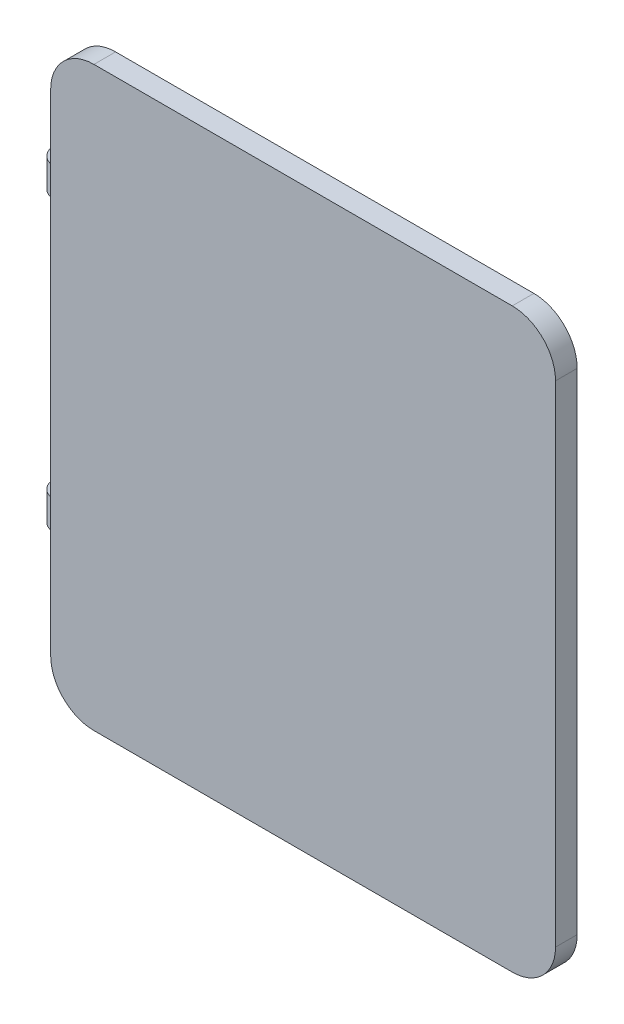
ISO-10303-21;
HEADER;
FILE_DESCRIPTION(('STEP AP214'),'2;1');
FILE_NAME('part.step','',(''),(''),'','','');
FILE_SCHEMA(('AUTOMOTIVE_DESIGN { 1 0 10303 214 1 1 1 1 }'));
ENDSEC;
DATA;
#1=APPLICATION_CONTEXT('core data for automotive mechanical design processes');
#2=APPLICATION_PROTOCOL_DEFINITION('international standard','automotive_design',2000,#1);
#3=PRODUCT_CONTEXT('',#1,'mechanical');
#4=PRODUCT('Part','Part','',(#3));
#5=PRODUCT_RELATED_PRODUCT_CATEGORY('part','',(#4));
#6=PRODUCT_DEFINITION_FORMATION('','',#4);
#7=PRODUCT_DEFINITION_CONTEXT('part definition',#1,'design');
#8=PRODUCT_DEFINITION('design','',#6,#7);
#9=PRODUCT_DEFINITION_SHAPE('','',#8);
#10=(LENGTH_UNIT() NAMED_UNIT(*) SI_UNIT(.MILLI.,.METRE.));
#11=(NAMED_UNIT(*) PLANE_ANGLE_UNIT() SI_UNIT($,.RADIAN.));
#12=(NAMED_UNIT(*) SI_UNIT($,.STERADIAN.) SOLID_ANGLE_UNIT());
#13=UNCERTAINTY_MEASURE_WITH_UNIT(LENGTH_MEASURE(1.E-05),#10,'distance_accuracy_value','');
#14=(GEOMETRIC_REPRESENTATION_CONTEXT(3) GLOBAL_UNCERTAINTY_ASSIGNED_CONTEXT((#13)) GLOBAL_UNIT_ASSIGNED_CONTEXT((#10,
#11,#12)) REPRESENTATION_CONTEXT('',''));
#15=CARTESIAN_POINT('',(0.,0.,0.));
#16=DIRECTION('',(0.,0.,1.));
#17=DIRECTION('',(1.,0.,0.));
#18=AXIS2_PLACEMENT_3D('',#15,#16,#17);
#19=CARTESIAN_POINT('',(0.,0.,0.));
#20=DIRECTION('',(0.,0.,1.));
#21=DIRECTION('',(1.,0.,0.));
#22=AXIS2_PLACEMENT_3D('',#19,#20,#21);
#23=PLANE('',#22);
#24=CARTESIAN_POINT('',(145.,-40.,0.));
#25=DIRECTION('',(0.,0.,1.));
#26=DIRECTION('',(1.,0.,0.));
#27=AXIS2_PLACEMENT_3D('',#24,#25,#26);
#28=CIRCLE('',#27,7.50000000000001);
#29=CARTESIAN_POINT('',(152.5,-40.,0.));
#30=VERTEX_POINT('',#29);
#31=EDGE_CURVE('E11',#30,#30,#28,.F.);
#32=ORIENTED_EDGE('',*,*,#31,.F.);
#33=EDGE_LOOP('',(#32));
#34=FACE_BOUND('',#33,.T.);
#35=CARTESIAN_POINT('',(145.,40.,0.));
#36=DIRECTION('',(0.,0.,1.));
#37=DIRECTION('',(1.,0.,0.));
#38=AXIS2_PLACEMENT_3D('',#35,#36,#37);
#39=CIRCLE('',#38,7.50000000000001);
#40=CARTESIAN_POINT('',(152.5,40.,0.));
#41=VERTEX_POINT('',#40);
#42=EDGE_CURVE('E47',#41,#41,#39,.F.);
#43=ORIENTED_EDGE('',*,*,#42,.F.);
#44=EDGE_LOOP('',(#43));
#45=FACE_BOUND('',#44,.T.);
#46=CARTESIAN_POINT('',(-145.,170.,0.));
#47=DIRECTION('',(0.,0.,-1.));
#48=DIRECTION('',(-1.,0.,0.));
#49=AXIS2_PLACEMENT_3D('',#46,#47,#48);
#50=CIRCLE('',#49,30.);
#51=CARTESIAN_POINT('',(-175.,170.,0.));
#52=VERTEX_POINT('',#51);
#53=CARTESIAN_POINT('',(-145.,200.,0.));
#54=VERTEX_POINT('',#53);
#55=EDGE_CURVE('E236',#52,#54,#50,.T.);
#56=ORIENTED_EDGE('',*,*,#55,.T.);
#57=DIRECTION('',(-1.,0.,0.));
#58=VECTOR('',#57,1.);
#59=CARTESIAN_POINT('',(-175.,200.,0.));
#60=LINE('',#59,#58);
#61=CARTESIAN_POINT('',(145.,200.,0.));
#62=VERTEX_POINT('',#61);
#63=EDGE_CURVE('E345',#62,#54,#60,.T.);
#64=ORIENTED_EDGE('',*,*,#63,.F.);
#65=CARTESIAN_POINT('',(145.,170.,0.));
#66=DIRECTION('',(0.,0.,-1.));
#67=DIRECTION('',(-1.,0.,0.));
#68=AXIS2_PLACEMENT_3D('',#65,#66,#67);
#69=CIRCLE('',#68,30.);
#70=CARTESIAN_POINT('',(175.,170.,0.));
#71=VERTEX_POINT('',#70);
#72=EDGE_CURVE('E244',#71,#62,#69,.F.);
#73=ORIENTED_EDGE('',*,*,#72,.F.);
#74=DIRECTION('',(0.,1.,0.));
#75=VECTOR('',#74,1.);
#76=CARTESIAN_POINT('',(175.,-200.,0.));
#77=LINE('',#76,#75);
#78=CARTESIAN_POINT('',(175.,-170.,0.));
#79=VERTEX_POINT('',#78);
#80=EDGE_CURVE('E342',#79,#71,#77,.T.);
#81=ORIENTED_EDGE('',*,*,#80,.F.);
#82=CARTESIAN_POINT('',(145.,-170.,0.));
#83=DIRECTION('',(0.,0.,-1.));
#84=DIRECTION('',(-1.,0.,0.));
#85=AXIS2_PLACEMENT_3D('',#82,#83,#84);
#86=CIRCLE('',#85,30.);
#87=CARTESIAN_POINT('',(145.,-200.,0.));
#88=VERTEX_POINT('',#87);
#89=EDGE_CURVE('E237',#79,#88,#86,.T.);
#90=ORIENTED_EDGE('',*,*,#89,.T.);
#91=DIRECTION('',(1.,0.,0.));
#92=VECTOR('',#91,1.);
#93=CARTESIAN_POINT('',(-175.,-200.,0.));
#94=LINE('',#93,#92);
#95=CARTESIAN_POINT('',(-145.,-200.,0.));
#96=VERTEX_POINT('',#95);
#97=EDGE_CURVE('E322',#96,#88,#94,.T.);
#98=ORIENTED_EDGE('',*,*,#97,.F.);
#99=CARTESIAN_POINT('',(-145.,-170.,0.));
#100=DIRECTION('',(0.,0.,-1.));
#101=DIRECTION('',(-1.,0.,0.));
#102=AXIS2_PLACEMENT_3D('',#99,#100,#101);
#103=CIRCLE('',#102,30.);
#104=CARTESIAN_POINT('',(-175.,-170.,0.));
#105=VERTEX_POINT('',#104);
#106=EDGE_CURVE('E247',#96,#105,#103,.T.);
#107=ORIENTED_EDGE('',*,*,#106,.T.);
#108=DIRECTION('',(0.,-1.,0.));
#109=VECTOR('',#108,1.);
#110=CARTESIAN_POINT('',(-175.,-200.,0.));
#111=LINE('',#110,#109);
#112=CARTESIAN_POINT('',(-175.,-110.,0.));
#113=VERTEX_POINT('',#112);
#114=EDGE_CURVE('E348',#113,#105,#111,.T.);
#115=ORIENTED_EDGE('',*,*,#114,.F.);
#116=DIRECTION('',(-1.,0.,0.));
#117=VECTOR('',#116,1.);
#118=CARTESIAN_POINT('',(0.,-110.,0.));
#119=LINE('',#118,#117);
#120=CARTESIAN_POINT('',(-127.5,-110.,0.));
#121=VERTEX_POINT('',#120);
#122=EDGE_CURVE('E283',#121,#113,#119,.T.);
#123=ORIENTED_EDGE('',*,*,#122,.F.);
#124=DIRECTION('',(0.,1.,0.));
#125=VECTOR('',#124,1.);
#126=CARTESIAN_POINT('',(-127.5,-110.,0.));
#127=LINE('',#126,#125);
#128=CARTESIAN_POINT('',(-127.5,-90.,0.));
#129=VERTEX_POINT('',#128);
#130=EDGE_CURVE('E291',#121,#129,#127,.T.);
#131=ORIENTED_EDGE('',*,*,#130,.T.);
#132=DIRECTION('',(-1.,0.,0.));
#133=VECTOR('',#132,1.);
#134=CARTESIAN_POINT('',(0.,-90.,0.));
#135=LINE('',#134,#133);
#136=CARTESIAN_POINT('',(-175.,-90.,0.));
#137=VERTEX_POINT('',#136);
#138=EDGE_CURVE('E270',#129,#137,#135,.T.);
#139=ORIENTED_EDGE('',*,*,#138,.T.);
#140=CARTESIAN_POINT('',(-175.,90.,0.));
#141=VERTEX_POINT('',#140);
#142=EDGE_CURVE('E407',#141,#137,#111,.T.);
#143=ORIENTED_EDGE('',*,*,#142,.F.);
#144=DIRECTION('',(-1.,0.,0.));
#145=VECTOR('',#144,1.);
#146=CARTESIAN_POINT('',(0.,90.,0.));
#147=LINE('',#146,#145);
#148=CARTESIAN_POINT('',(-127.5,90.,0.));
#149=VERTEX_POINT('',#148);
#150=EDGE_CURVE('E353',#149,#141,#147,.T.);
#151=ORIENTED_EDGE('',*,*,#150,.F.);
#152=DIRECTION('',(0.,1.,0.));
#153=VECTOR('',#152,1.);
#154=CARTESIAN_POINT('',(-127.5,90.,0.));
#155=LINE('',#154,#153);
#156=CARTESIAN_POINT('',(-127.5,110.,0.));
#157=VERTEX_POINT('',#156);
#158=EDGE_CURVE('E319',#149,#157,#155,.T.);
#159=ORIENTED_EDGE('',*,*,#158,.T.);
#160=DIRECTION('',(-1.,0.,0.));
#161=VECTOR('',#160,1.);
#162=CARTESIAN_POINT('',(0.,110.,0.));
#163=LINE('',#162,#161);
#164=CARTESIAN_POINT('',(-175.,110.,0.));
#165=VERTEX_POINT('',#164);
#166=EDGE_CURVE('E339',#157,#165,#163,.T.);
#167=ORIENTED_EDGE('',*,*,#166,.T.);
#168=EDGE_CURVE('E330',#52,#165,#111,.T.);
#169=ORIENTED_EDGE('',*,*,#168,.F.);
#170=EDGE_LOOP('',(#56,#64,#73,#81,#90,#98,#107,#115,#123,#131,#139,#143,#151,#159,#167,#169));
#171=FACE_BOUND('',#170,.T.);
#172=ADVANCED_FACE('F39',(#34,#45,#171),#23,.F.);
#173=CARTESIAN_POINT('',(-175.,-200.,15.));
#174=DIRECTION('',(0.,1.,0.));
#175=DIRECTION('',(0.,0.,1.));
#176=AXIS2_PLACEMENT_3D('',#173,#174,#175);
#177=PLANE('',#176);
#178=DIRECTION('',(1.,0.,0.));
#179=VECTOR('',#178,1.);
#180=CARTESIAN_POINT('',(-175.,-200.,15.));
#181=LINE('',#180,#179);
#182=CARTESIAN_POINT('',(-145.,-200.,15.));
#183=VERTEX_POINT('',#182);
#184=CARTESIAN_POINT('',(145.,-200.,15.));
#185=VERTEX_POINT('',#184);
#186=EDGE_CURVE('E326',#183,#185,#181,.T.);
#187=ORIENTED_EDGE('',*,*,#186,.F.);
#188=DIRECTION('',(0.,0.,-1.));
#189=VECTOR('',#188,1.);
#190=CARTESIAN_POINT('',(-145.,-200.,74.));
#191=LINE('',#190,#189);
#192=EDGE_CURVE('E250',#183,#96,#191,.T.);
#193=ORIENTED_EDGE('',*,*,#192,.T.);
#194=ORIENTED_EDGE('',*,*,#97,.T.);
#195=DIRECTION('',(0.,0.,-1.));
#196=VECTOR('',#195,1.);
#197=CARTESIAN_POINT('',(145.,-200.,74.));
#198=LINE('',#197,#196);
#199=EDGE_CURVE('E242',#185,#88,#198,.T.);
#200=ORIENTED_EDGE('',*,*,#199,.F.);
#201=EDGE_LOOP('',(#187,#193,#194,#200));
#202=FACE_BOUND('',#201,.T.);
#203=ADVANCED_FACE('F41',(#202),#177,.F.);
#204=CARTESIAN_POINT('',(-175.,200.,15.));
#205=DIRECTION('',(0.,-1.,0.));
#206=DIRECTION('',(0.,0.,-1.));
#207=AXIS2_PLACEMENT_3D('',#204,#205,#206);
#208=PLANE('',#207);
#209=DIRECTION('',(0.,0.,-1.));
#210=VECTOR('',#209,1.);
#211=CARTESIAN_POINT('',(-145.,200.,74.));
#212=LINE('',#211,#210);
#213=CARTESIAN_POINT('',(-145.,200.,15.));
#214=VERTEX_POINT('',#213);
#215=EDGE_CURVE('E251',#214,#54,#212,.T.);
#216=ORIENTED_EDGE('',*,*,#215,.F.);
#217=DIRECTION('',(-1.,0.,0.));
#218=VECTOR('',#217,1.);
#219=CARTESIAN_POINT('',(-175.,200.,15.));
#220=LINE('',#219,#218);
#221=CARTESIAN_POINT('',(145.,200.,15.));
#222=VERTEX_POINT('',#221);
#223=EDGE_CURVE('E333',#222,#214,#220,.T.);
#224=ORIENTED_EDGE('',*,*,#223,.F.);
#225=DIRECTION('',(0.,0.,-1.));
#226=VECTOR('',#225,1.);
#227=CARTESIAN_POINT('',(145.,200.,74.));
#228=LINE('',#227,#226);
#229=EDGE_CURVE('E62',#222,#62,#228,.T.);
#230=ORIENTED_EDGE('',*,*,#229,.T.);
#231=ORIENTED_EDGE('',*,*,#63,.T.);
#232=EDGE_LOOP('',(#216,#224,#230,#231));
#233=FACE_BOUND('',#232,.T.);
#234=ADVANCED_FACE('F378',(#233),#208,.F.);
#235=CARTESIAN_POINT('',(-175.,-200.,15.));
#236=DIRECTION('',(1.,0.,0.));
#237=DIRECTION('',(0.,0.,-1.));
#238=AXIS2_PLACEMENT_3D('',#235,#236,#237);
#239=PLANE('',#238);
#240=DIRECTION('',(0.,-1.,0.));
#241=VECTOR('',#240,1.);
#242=CARTESIAN_POINT('',(-175.,-200.,15.));
#243=LINE('',#242,#241);
#244=CARTESIAN_POINT('',(-175.,170.,15.));
#245=VERTEX_POINT('',#244);
#246=CARTESIAN_POINT('',(-175.,-170.,15.));
#247=VERTEX_POINT('',#246);
#248=EDGE_CURVE('E336',#245,#247,#243,.T.);
#249=ORIENTED_EDGE('',*,*,#248,.F.);
#250=DIRECTION('',(0.,0.,-1.));
#251=VECTOR('',#250,1.);
#252=CARTESIAN_POINT('',(-175.,170.,74.));
#253=LINE('',#252,#251);
#254=EDGE_CURVE('E54',#245,#52,#253,.T.);
#255=ORIENTED_EDGE('',*,*,#254,.T.);
#256=ORIENTED_EDGE('',*,*,#168,.T.);
#257=EDGE_CURVE('E350',#165,#141,#111,.T.);
#258=ORIENTED_EDGE('',*,*,#257,.T.);
#259=ORIENTED_EDGE('',*,*,#142,.T.);
#260=EDGE_CURVE('E403',#137,#113,#111,.T.);
#261=ORIENTED_EDGE('',*,*,#260,.T.);
#262=ORIENTED_EDGE('',*,*,#114,.T.);
#263=DIRECTION('',(0.,0.,-1.));
#264=VECTOR('',#263,1.);
#265=CARTESIAN_POINT('',(-175.,-170.,74.));
#266=LINE('',#265,#264);
#267=EDGE_CURVE('E241',#247,#105,#266,.T.);
#268=ORIENTED_EDGE('',*,*,#267,.F.);
#269=EDGE_LOOP('',(#249,#255,#256,#258,#259,#261,#262,#268));
#270=FACE_BOUND('',#269,.T.);
#271=ADVANCED_FACE('F398',(#270),#239,.F.);
#272=CARTESIAN_POINT('',(0.,0.,15.));
#273=DIRECTION('',(0.,0.,1.));
#274=DIRECTION('',(1.,0.,0.));
#275=AXIS2_PLACEMENT_3D('',#272,#273,#274);
#276=PLANE('',#275);
#277=ORIENTED_EDGE('',*,*,#223,.T.);
#278=CARTESIAN_POINT('',(-145.,170.,15.));
#279=DIRECTION('',(0.,0.,1.));
#280=DIRECTION('',(1.,0.,0.));
#281=AXIS2_PLACEMENT_3D('',#278,#279,#280);
#282=CIRCLE('',#281,30.);
#283=EDGE_CURVE('E363',#214,#245,#282,.T.);
#284=ORIENTED_EDGE('',*,*,#283,.T.);
#285=ORIENTED_EDGE('',*,*,#248,.T.);
#286=CARTESIAN_POINT('',(-145.,-170.,15.));
#287=DIRECTION('',(0.,0.,1.));
#288=DIRECTION('',(1.,0.,0.));
#289=AXIS2_PLACEMENT_3D('',#286,#287,#288);
#290=CIRCLE('',#289,30.);
#291=EDGE_CURVE('E360',#247,#183,#290,.T.);
#292=ORIENTED_EDGE('',*,*,#291,.T.);
#293=ORIENTED_EDGE('',*,*,#186,.T.);
#294=CARTESIAN_POINT('',(145.,-170.,15.));
#295=DIRECTION('',(0.,0.,1.));
#296=DIRECTION('',(1.,0.,0.));
#297=AXIS2_PLACEMENT_3D('',#294,#295,#296);
#298=CIRCLE('',#297,30.);
#299=CARTESIAN_POINT('',(175.,-170.,15.));
#300=VERTEX_POINT('',#299);
#301=EDGE_CURVE('E357',#185,#300,#298,.T.);
#302=ORIENTED_EDGE('',*,*,#301,.T.);
#303=DIRECTION('',(0.,1.,0.));
#304=VECTOR('',#303,1.);
#305=CARTESIAN_POINT('',(175.,-200.,15.));
#306=LINE('',#305,#304);
#307=CARTESIAN_POINT('',(175.,170.,15.));
#308=VERTEX_POINT('',#307);
#309=EDGE_CURVE('E329',#300,#308,#306,.T.);
#310=ORIENTED_EDGE('',*,*,#309,.T.);
#311=CARTESIAN_POINT('',(145.,170.,15.));
#312=DIRECTION('',(0.,0.,1.));
#313=DIRECTION('',(1.,0.,0.));
#314=AXIS2_PLACEMENT_3D('',#311,#312,#313);
#315=CIRCLE('',#314,30.);
#316=EDGE_CURVE('E355',#222,#308,#315,.F.);
#317=ORIENTED_EDGE('',*,*,#316,.F.);
#318=EDGE_LOOP('',(#277,#284,#285,#292,#293,#302,#310,#317));
#319=FACE_BOUND('',#318,.T.);
#320=ADVANCED_FACE('F381',(#319),#276,.T.);
#321=CARTESIAN_POINT('',(175.,-200.,15.));
#322=DIRECTION('',(-1.,0.,0.));
#323=DIRECTION('',(0.,0.,1.));
#324=AXIS2_PLACEMENT_3D('',#321,#322,#323);
#325=PLANE('',#324);
#326=ORIENTED_EDGE('',*,*,#309,.F.);
#327=DIRECTION('',(0.,0.,-1.));
#328=VECTOR('',#327,1.);
#329=CARTESIAN_POINT('',(175.,-170.,74.));
#330=LINE('',#329,#328);
#331=EDGE_CURVE('E240',#300,#79,#330,.T.);
#332=ORIENTED_EDGE('',*,*,#331,.T.);
#333=ORIENTED_EDGE('',*,*,#80,.T.);
#334=DIRECTION('',(0.,0.,-1.));
#335=VECTOR('',#334,1.);
#336=CARTESIAN_POINT('',(175.,170.,74.));
#337=LINE('',#336,#335);
#338=EDGE_CURVE('E260',#308,#71,#337,.T.);
#339=ORIENTED_EDGE('',*,*,#338,.F.);
#340=EDGE_LOOP('',(#326,#332,#333,#339));
#341=FACE_BOUND('',#340,.T.);
#342=ADVANCED_FACE('F387',(#341),#325,.F.);
#343=CARTESIAN_POINT('',(0.,90.,0.));
#344=DIRECTION('',(0.,0.,1.));
#345=DIRECTION('',(1.,0.,0.));
#346=AXIS2_PLACEMENT_3D('',#343,#344,#345);
#347=PLANE('',#346);
#348=ORIENTED_EDGE('',*,*,#257,.F.);
#349=DIRECTION('',(1.,0.,0.));
#350=VECTOR('',#349,1.);
#351=CARTESIAN_POINT('',(0.,110.,0.));
#352=LINE('',#351,#350);
#353=CARTESIAN_POINT('',(-187.5,110.,0.));
#354=VERTEX_POINT('',#353);
#355=EDGE_CURVE('E301',#354,#165,#352,.T.);
#356=ORIENTED_EDGE('',*,*,#355,.F.);
#357=DIRECTION('',(0.,1.,0.));
#358=VECTOR('',#357,1.);
#359=CARTESIAN_POINT('',(-187.5,90.,0.));
#360=LINE('',#359,#358);
#361=CARTESIAN_POINT('',(-187.5,90.,0.));
#362=VERTEX_POINT('',#361);
#363=EDGE_CURVE('E323',#362,#354,#360,.T.);
#364=ORIENTED_EDGE('',*,*,#363,.F.);
#365=DIRECTION('',(1.,0.,0.));
#366=VECTOR('',#365,1.);
#367=CARTESIAN_POINT('',(0.,90.,0.));
#368=LINE('',#367,#366);
#369=EDGE_CURVE('E312',#362,#141,#368,.T.);
#370=ORIENTED_EDGE('',*,*,#369,.T.);
#371=EDGE_LOOP('',(#348,#356,#364,#370));
#372=FACE_BOUND('',#371,.T.);
#373=ADVANCED_FACE('F414',(#372),#347,.T.);
#374=CARTESIAN_POINT('',(-20.3321696230077,90.,46.6792727594885));
#375=DIRECTION('',(-0.399334442595674,0.,0.916805324459235));
#376=DIRECTION('',(0.916805324459235,0.,0.399334442595674));
#377=AXIS2_PLACEMENT_3D('',#374,#375,#376);
#378=PLANE('',#377);
#379=DIRECTION('',(0.,1.,0.));
#380=VECTOR('',#379,1.);
#381=CARTESIAN_POINT('',(-182.508319467554,90.,-23.9600665557404));
#382=LINE('',#381,#380);
#383=CARTESIAN_POINT('',(-182.508319467554,90.,-23.9600665557404));
#384=VERTEX_POINT('',#383);
#385=CARTESIAN_POINT('',(-182.508319467554,110.,-23.9600665557404));
#386=VERTEX_POINT('',#385);
#387=EDGE_CURVE('E318',#384,#386,#382,.T.);
#388=ORIENTED_EDGE('',*,*,#387,.T.);
#389=DIRECTION('',(0.916805324459235,0.,0.399334442595674));
#390=VECTOR('',#389,1.);
#391=CARTESIAN_POINT('',(-20.3321696230077,110.,46.6792727594885));
#392=LINE('',#391,#390);
#393=EDGE_CURVE('E290',#386,#157,#392,.T.);
#394=ORIENTED_EDGE('',*,*,#393,.T.);
#395=ORIENTED_EDGE('',*,*,#158,.F.);
#396=DIRECTION('',(0.916805324459235,0.,0.399334442595674));
#397=VECTOR('',#396,1.);
#398=CARTESIAN_POINT('',(-20.3321696230077,90.,46.6792727594885));
#399=LINE('',#398,#397);
#400=EDGE_CURVE('E307',#384,#149,#399,.T.);
#401=ORIENTED_EDGE('',*,*,#400,.F.);
#402=EDGE_LOOP('',(#388,#394,#395,#401));
#403=FACE_BOUND('',#402,.T.);
#404=ADVANCED_FACE('F423',(#403),#378,.F.);
#405=CARTESIAN_POINT('',(-187.5,90.,-12.5));
#406=DIRECTION('',(0.,1.,0.));
#407=DIRECTION('',(0.,0.,1.));
#408=AXIS2_PLACEMENT_3D('',#405,#406,#407);
#409=CYLINDRICAL_SURFACE('',#408,12.5);
#410=ORIENTED_EDGE('',*,*,#363,.T.);
#411=CARTESIAN_POINT('',(-187.5,110.,-12.5));
#412=DIRECTION('',(0.,1.,0.));
#413=DIRECTION('',(0.,0.,1.));
#414=AXIS2_PLACEMENT_3D('',#411,#412,#413);
#415=CIRCLE('',#414,12.5);
#416=EDGE_CURVE('E298',#386,#354,#415,.T.);
#417=ORIENTED_EDGE('',*,*,#416,.F.);
#418=ORIENTED_EDGE('',*,*,#387,.F.);
#419=CARTESIAN_POINT('',(-187.5,90.,-12.5));
#420=DIRECTION('',(0.,1.,0.));
#421=DIRECTION('',(0.,0.,1.));
#422=AXIS2_PLACEMENT_3D('',#419,#420,#421);
#423=CIRCLE('',#422,12.5);
#424=EDGE_CURVE('E309',#384,#362,#423,.T.);
#425=ORIENTED_EDGE('',*,*,#424,.T.);
#426=EDGE_LOOP('',(#410,#417,#418,#425));
#427=FACE_BOUND('',#426,.T.);
#428=ADVANCED_FACE('F428',(#427),#409,.T.);
#429=CARTESIAN_POINT('',(-187.5,90.,-12.5));
#430=DIRECTION('',(0.,1.,0.));
#431=DIRECTION('',(0.,0.,1.));
#432=AXIS2_PLACEMENT_3D('',#429,#430,#431);
#433=CYLINDRICAL_SURFACE('',#432,10.);
#434=CARTESIAN_POINT('',(-187.5,90.,-12.5));
#435=DIRECTION('',(0.,1.,0.));
#436=DIRECTION('',(0.,0.,1.));
#437=AXIS2_PLACEMENT_3D('',#434,#435,#436);
#438=CIRCLE('',#437,10.);
#439=CARTESIAN_POINT('',(-187.5,90.,-2.49999999999999));
#440=VERTEX_POINT('',#439);
#441=EDGE_CURVE('E315',#440,#440,#438,.T.);
#442=ORIENTED_EDGE('',*,*,#441,.F.);
#443=EDGE_LOOP('',(#442));
#444=FACE_BOUND('',#443,.T.);
#445=CARTESIAN_POINT('',(-187.5,110.,-12.5));
#446=DIRECTION('',(0.,1.,0.));
#447=DIRECTION('',(0.,0.,1.));
#448=AXIS2_PLACEMENT_3D('',#445,#446,#447);
#449=CIRCLE('',#448,10.);
#450=CARTESIAN_POINT('',(-187.5,110.,-2.49999999999999));
#451=VERTEX_POINT('',#450);
#452=EDGE_CURVE('E304',#451,#451,#449,.T.);
#453=ORIENTED_EDGE('',*,*,#452,.T.);
#454=EDGE_LOOP('',(#453));
#455=FACE_BOUND('',#454,.T.);
#456=ADVANCED_FACE('F471',(#444,#455),#433,.F.);
#457=CARTESIAN_POINT('',(0.,90.,0.));
#458=DIRECTION('',(0.,1.,0.));
#459=DIRECTION('',(0.,0.,1.));
#460=AXIS2_PLACEMENT_3D('',#457,#458,#459);
#461=PLANE('',#460);
#462=ORIENTED_EDGE('',*,*,#400,.T.);
#463=ORIENTED_EDGE('',*,*,#150,.T.);
#464=ORIENTED_EDGE('',*,*,#369,.F.);
#465=ORIENTED_EDGE('',*,*,#424,.F.);
#466=EDGE_LOOP('',(#462,#463,#464,#465));
#467=FACE_BOUND('',#466,.T.);
#468=ORIENTED_EDGE('',*,*,#441,.T.);
#469=EDGE_LOOP('',(#468));
#470=FACE_BOUND('',#469,.T.);
#471=ADVANCED_FACE('F430',(#467,#470),#461,.F.);
#472=CARTESIAN_POINT('',(0.,110.,0.));
#473=DIRECTION('',(0.,1.,0.));
#474=DIRECTION('',(0.,0.,1.));
#475=AXIS2_PLACEMENT_3D('',#472,#473,#474);
#476=PLANE('',#475);
#477=ORIENTED_EDGE('',*,*,#393,.F.);
#478=ORIENTED_EDGE('',*,*,#416,.T.);
#479=ORIENTED_EDGE('',*,*,#355,.T.);
#480=ORIENTED_EDGE('',*,*,#166,.F.);
#481=EDGE_LOOP('',(#477,#478,#479,#480));
#482=FACE_BOUND('',#481,.T.);
#483=ORIENTED_EDGE('',*,*,#452,.F.);
#484=EDGE_LOOP('',(#483));
#485=FACE_BOUND('',#484,.T.);
#486=ADVANCED_FACE('F420',(#482,#485),#476,.T.);
#487=CARTESIAN_POINT('',(0.,-110.,0.));
#488=DIRECTION('',(0.,0.,-1.));
#489=DIRECTION('',(-1.,0.,0.));
#490=AXIS2_PLACEMENT_3D('',#487,#488,#489);
#491=PLANE('',#490);
#492=CARTESIAN_POINT('',(-187.5,-110.,0.));
#493=VERTEX_POINT('',#492);
#494=EDGE_CURVE('E282',#113,#493,#119,.T.);
#495=ORIENTED_EDGE('',*,*,#494,.F.);
#496=ORIENTED_EDGE('',*,*,#260,.F.);
#497=CARTESIAN_POINT('',(-187.5,-90.,0.));
#498=VERTEX_POINT('',#497);
#499=EDGE_CURVE('E269',#137,#498,#135,.T.);
#500=ORIENTED_EDGE('',*,*,#499,.T.);
#501=DIRECTION('',(0.,1.,0.));
#502=VECTOR('',#501,1.);
#503=CARTESIAN_POINT('',(-187.5,-110.,0.));
#504=LINE('',#503,#502);
#505=EDGE_CURVE('E287',#493,#498,#504,.T.);
#506=ORIENTED_EDGE('',*,*,#505,.F.);
#507=EDGE_LOOP('',(#495,#496,#500,#506));
#508=FACE_BOUND('',#507,.T.);
#509=ADVANCED_FACE('F444',(#508),#491,.F.);
#510=CARTESIAN_POINT('',(-187.5,-110.,-12.5));
#511=DIRECTION('',(0.,1.,0.));
#512=DIRECTION('',(0.,0.,1.));
#513=AXIS2_PLACEMENT_3D('',#510,#511,#512);
#514=CYLINDRICAL_SURFACE('',#513,12.5);
#515=ORIENTED_EDGE('',*,*,#505,.T.);
#516=CARTESIAN_POINT('',(-187.5,-90.,-12.5));
#517=DIRECTION('',(0.,1.,0.));
#518=DIRECTION('',(0.,0.,1.));
#519=AXIS2_PLACEMENT_3D('',#516,#517,#518);
#520=CIRCLE('',#519,12.5);
#521=CARTESIAN_POINT('',(-182.508319467554,-90.,-23.9600665557404));
#522=VERTEX_POINT('',#521);
#523=EDGE_CURVE('E266',#522,#498,#520,.T.);
#524=ORIENTED_EDGE('',*,*,#523,.F.);
#525=DIRECTION('',(0.,1.,0.));
#526=VECTOR('',#525,1.);
#527=CARTESIAN_POINT('',(-182.508319467554,-110.,-23.9600665557404));
#528=LINE('',#527,#526);
#529=CARTESIAN_POINT('',(-182.508319467554,-110.,-23.9600665557404));
#530=VERTEX_POINT('',#529);
#531=EDGE_CURVE('E288',#530,#522,#528,.T.);
#532=ORIENTED_EDGE('',*,*,#531,.F.);
#533=CARTESIAN_POINT('',(-187.5,-110.,-12.5));
#534=DIRECTION('',(0.,1.,0.));
#535=DIRECTION('',(0.,0.,1.));
#536=AXIS2_PLACEMENT_3D('',#533,#534,#535);
#537=CIRCLE('',#536,12.5);
#538=EDGE_CURVE('E279',#530,#493,#537,.T.);
#539=ORIENTED_EDGE('',*,*,#538,.T.);
#540=EDGE_LOOP('',(#515,#524,#532,#539));
#541=FACE_BOUND('',#540,.T.);
#542=ADVANCED_FACE('F442',(#541),#514,.T.);
#543=CARTESIAN_POINT('',(-20.3321696230077,-110.,46.6792727594884));
#544=DIRECTION('',(-0.399334442595674,0.,0.916805324459235));
#545=DIRECTION('',(0.916805324459235,0.,0.399334442595674));
#546=AXIS2_PLACEMENT_3D('',#543,#544,#545);
#547=PLANE('',#546);
#548=ORIENTED_EDGE('',*,*,#531,.T.);
#549=DIRECTION('',(0.916805324459235,0.,0.399334442595674));
#550=VECTOR('',#549,1.);
#551=CARTESIAN_POINT('',(-20.3321696230077,-90.,46.6792727594884));
#552=LINE('',#551,#550);
#553=EDGE_CURVE('E273',#522,#129,#552,.T.);
#554=ORIENTED_EDGE('',*,*,#553,.T.);
#555=ORIENTED_EDGE('',*,*,#130,.F.);
#556=DIRECTION('',(0.916805324459235,0.,0.399334442595674));
#557=VECTOR('',#556,1.);
#558=CARTESIAN_POINT('',(-20.3321696230077,-110.,46.6792727594884));
#559=LINE('',#558,#557);
#560=EDGE_CURVE('E285',#530,#121,#559,.T.);
#561=ORIENTED_EDGE('',*,*,#560,.F.);
#562=EDGE_LOOP('',(#548,#554,#555,#561));
#563=FACE_BOUND('',#562,.T.);
#564=ADVANCED_FACE('F437',(#563),#547,.F.);
#565=CARTESIAN_POINT('',(-187.5,-110.,-12.5));
#566=DIRECTION('',(0.,1.,0.));
#567=DIRECTION('',(0.,0.,1.));
#568=AXIS2_PLACEMENT_3D('',#565,#566,#567);
#569=CYLINDRICAL_SURFACE('',#568,10.);
#570=CARTESIAN_POINT('',(-187.5,-110.,-12.5));
#571=DIRECTION('',(0.,1.,0.));
#572=DIRECTION('',(0.,0.,1.));
#573=AXIS2_PLACEMENT_3D('',#570,#571,#572);
#574=CIRCLE('',#573,10.);
#575=CARTESIAN_POINT('',(-187.5,-110.,-2.49999999999998));
#576=VERTEX_POINT('',#575);
#577=EDGE_CURVE('E276',#576,#576,#574,.T.);
#578=ORIENTED_EDGE('',*,*,#577,.F.);
#579=EDGE_LOOP('',(#578));
#580=FACE_BOUND('',#579,.T.);
#581=CARTESIAN_POINT('',(-187.5,-90.,-12.5));
#582=DIRECTION('',(0.,1.,0.));
#583=DIRECTION('',(0.,0.,1.));
#584=AXIS2_PLACEMENT_3D('',#581,#582,#583);
#585=CIRCLE('',#584,10.);
#586=CARTESIAN_POINT('',(-187.5,-90.,-2.49999999999998));
#587=VERTEX_POINT('',#586);
#588=EDGE_CURVE('E262',#587,#587,#585,.T.);
#589=ORIENTED_EDGE('',*,*,#588,.T.);
#590=EDGE_LOOP('',(#589));
#591=FACE_BOUND('',#590,.T.);
#592=ADVANCED_FACE('F448',(#580,#591),#569,.F.);
#593=CARTESIAN_POINT('',(0.,-110.,0.));
#594=DIRECTION('',(0.,1.,0.));
#595=DIRECTION('',(0.,0.,1.));
#596=AXIS2_PLACEMENT_3D('',#593,#594,#595);
#597=PLANE('',#596);
#598=ORIENTED_EDGE('',*,*,#577,.T.);
#599=EDGE_LOOP('',(#598));
#600=FACE_BOUND('',#599,.T.);
#601=ORIENTED_EDGE('',*,*,#538,.F.);
#602=ORIENTED_EDGE('',*,*,#560,.T.);
#603=ORIENTED_EDGE('',*,*,#122,.T.);
#604=ORIENTED_EDGE('',*,*,#494,.T.);
#605=EDGE_LOOP('',(#601,#602,#603,#604));
#606=FACE_BOUND('',#605,.T.);
#607=ADVANCED_FACE('F446',(#600,#606),#597,.F.);
#608=CARTESIAN_POINT('',(0.,-90.,0.));
#609=DIRECTION('',(0.,1.,0.));
#610=DIRECTION('',(0.,0.,1.));
#611=AXIS2_PLACEMENT_3D('',#608,#609,#610);
#612=PLANE('',#611);
#613=ORIENTED_EDGE('',*,*,#588,.F.);
#614=EDGE_LOOP('',(#613));
#615=FACE_BOUND('',#614,.T.);
#616=ORIENTED_EDGE('',*,*,#523,.T.);
#617=ORIENTED_EDGE('',*,*,#499,.F.);
#618=ORIENTED_EDGE('',*,*,#138,.F.);
#619=ORIENTED_EDGE('',*,*,#553,.F.);
#620=EDGE_LOOP('',(#616,#617,#618,#619));
#621=FACE_BOUND('',#620,.T.);
#622=ADVANCED_FACE('F435',(#615,#621),#612,.T.);
#623=CARTESIAN_POINT('',(145.,170.,74.));
#624=DIRECTION('',(0.,0.,-1.));
#625=DIRECTION('',(-1.,0.,0.));
#626=AXIS2_PLACEMENT_3D('',#623,#624,#625);
#627=CYLINDRICAL_SURFACE('',#626,30.);
#628=ORIENTED_EDGE('',*,*,#316,.T.);
#629=ORIENTED_EDGE('',*,*,#338,.T.);
#630=ORIENTED_EDGE('',*,*,#72,.T.);
#631=ORIENTED_EDGE('',*,*,#229,.F.);
#632=EDGE_LOOP('',(#628,#629,#630,#631));
#633=FACE_BOUND('',#632,.T.);
#634=ADVANCED_FACE('F385',(#633),#627,.T.);
#635=CARTESIAN_POINT('',(145.,-170.,74.));
#636=DIRECTION('',(0.,0.,-1.));
#637=DIRECTION('',(-1.,0.,0.));
#638=AXIS2_PLACEMENT_3D('',#635,#636,#637);
#639=CYLINDRICAL_SURFACE('',#638,30.);
#640=ORIENTED_EDGE('',*,*,#199,.T.);
#641=ORIENTED_EDGE('',*,*,#89,.F.);
#642=ORIENTED_EDGE('',*,*,#331,.F.);
#643=ORIENTED_EDGE('',*,*,#301,.F.);
#644=EDGE_LOOP('',(#640,#641,#642,#643));
#645=FACE_BOUND('',#644,.T.);
#646=ADVANCED_FACE('F700',(#645),#639,.T.);
#647=CARTESIAN_POINT('',(-145.,-170.,74.));
#648=DIRECTION('',(0.,0.,-1.));
#649=DIRECTION('',(-1.,0.,0.));
#650=AXIS2_PLACEMENT_3D('',#647,#648,#649);
#651=CYLINDRICAL_SURFACE('',#650,30.);
#652=ORIENTED_EDGE('',*,*,#267,.T.);
#653=ORIENTED_EDGE('',*,*,#106,.F.);
#654=ORIENTED_EDGE('',*,*,#192,.F.);
#655=ORIENTED_EDGE('',*,*,#291,.F.);
#656=EDGE_LOOP('',(#652,#653,#654,#655));
#657=FACE_BOUND('',#656,.T.);
#658=ADVANCED_FACE('F395',(#657),#651,.T.);
#659=CARTESIAN_POINT('',(-145.,170.,74.));
#660=DIRECTION('',(0.,0.,-1.));
#661=DIRECTION('',(-1.,0.,0.));
#662=AXIS2_PLACEMENT_3D('',#659,#660,#661);
#663=CYLINDRICAL_SURFACE('',#662,30.);
#664=ORIENTED_EDGE('',*,*,#215,.T.);
#665=ORIENTED_EDGE('',*,*,#55,.F.);
#666=ORIENTED_EDGE('',*,*,#254,.F.);
#667=ORIENTED_EDGE('',*,*,#283,.F.);
#668=EDGE_LOOP('',(#664,#665,#666,#667));
#669=FACE_BOUND('',#668,.T.);
#670=ADVANCED_FACE('F581',(#669),#663,.T.);
#671=CARTESIAN_POINT('',(145.,40.,-10.));
#672=DIRECTION('',(0.,0.,1.));
#673=DIRECTION('',(1.,0.,0.));
#674=AXIS2_PLACEMENT_3D('',#671,#672,#673);
#675=CYLINDRICAL_SURFACE('',#674,7.50000000000001);
#676=CARTESIAN_POINT('',(145.,40.,-10.));
#677=DIRECTION('',(0.,0.,-1.));
#678=DIRECTION('',(-1.,0.,0.));
#679=AXIS2_PLACEMENT_3D('',#676,#677,#678);
#680=CIRCLE('',#679,7.50000000000001);
#681=CARTESIAN_POINT('',(137.5,40.,-10.));
#682=VERTEX_POINT('',#681);
#683=EDGE_CURVE('E228',#682,#682,#680,.T.);
#684=ORIENTED_EDGE('',*,*,#683,.F.);
#685=EDGE_LOOP('',(#684));
#686=FACE_BOUND('',#685,.T.);
#687=ORIENTED_EDGE('',*,*,#42,.T.);
#688=EDGE_LOOP('',(#687));
#689=FACE_BOUND('',#688,.T.);
#690=ADVANCED_FACE('F367',(#686,#689),#675,.T.);
#691=CARTESIAN_POINT('',(145.,-40.,-10.));
#692=DIRECTION('',(0.,0.,1.));
#693=DIRECTION('',(1.,0.,0.));
#694=AXIS2_PLACEMENT_3D('',#691,#692,#693);
#695=CYLINDRICAL_SURFACE('',#694,7.50000000000001);
#696=CARTESIAN_POINT('',(145.,-40.,-10.));
#697=DIRECTION('',(0.,0.,-1.));
#698=DIRECTION('',(1.,0.,0.));
#699=AXIS2_PLACEMENT_3D('',#696,#697,#698);
#700=CIRCLE('',#699,7.50000000000001);
#701=CARTESIAN_POINT('',(152.5,-40.,-10.));
#702=VERTEX_POINT('',#701);
#703=EDGE_CURVE('E225',#702,#702,#700,.T.);
#704=ORIENTED_EDGE('',*,*,#703,.F.);
#705=EDGE_LOOP('',(#704));
#706=FACE_BOUND('',#705,.T.);
#707=ORIENTED_EDGE('',*,*,#31,.T.);
#708=EDGE_LOOP('',(#707));
#709=FACE_BOUND('',#708,.T.);
#710=ADVANCED_FACE('F590',(#706,#709),#695,.T.);
#711=CARTESIAN_POINT('',(140.,-45.,-15.));
#712=DIRECTION('',(0.,0.,1.));
#713=DIRECTION('',(1.,0.,0.));
#714=AXIS2_PLACEMENT_3D('',#711,#712,#713);
#715=CYLINDRICAL_SURFACE('',#714,5.);
#716=CARTESIAN_POINT('',(140.,-45.,-10.));
#717=DIRECTION('',(0.,0.,-1.));
#718=DIRECTION('',(-1.,0.,0.));
#719=AXIS2_PLACEMENT_3D('',#716,#717,#718);
#720=CIRCLE('',#719,5.);
#721=CARTESIAN_POINT('',(140.,-50.,-10.));
#722=VERTEX_POINT('',#721);
#723=CARTESIAN_POINT('',(135.,-45.,-10.));
#724=VERTEX_POINT('',#723);
#725=EDGE_CURVE('E224',#722,#724,#720,.T.);
#726=ORIENTED_EDGE('',*,*,#725,.T.);
#727=DIRECTION('',(0.,0.,1.));
#728=VECTOR('',#727,1.);
#729=CARTESIAN_POINT('',(135.,-45.,-15.));
#730=LINE('',#729,#728);
#731=CARTESIAN_POINT('',(135.,-45.,-15.));
#732=VERTEX_POINT('',#731);
#733=EDGE_CURVE('E204',#732,#724,#730,.T.);
#734=ORIENTED_EDGE('',*,*,#733,.F.);
#735=CARTESIAN_POINT('',(140.,-45.,-15.));
#736=DIRECTION('',(0.,0.,-1.));
#737=DIRECTION('',(-1.,0.,0.));
#738=AXIS2_PLACEMENT_3D('',#735,#736,#737);
#739=CIRCLE('',#738,5.);
#740=CARTESIAN_POINT('',(140.,-50.,-15.));
#741=VERTEX_POINT('',#740);
#742=EDGE_CURVE('E211',#741,#732,#739,.T.);
#743=ORIENTED_EDGE('',*,*,#742,.F.);
#744=DIRECTION('',(0.,0.,1.));
#745=VECTOR('',#744,1.);
#746=CARTESIAN_POINT('',(140.,-50.,-15.));
#747=LINE('',#746,#745);
#748=EDGE_CURVE('E746',#741,#722,#747,.T.);
#749=ORIENTED_EDGE('',*,*,#748,.T.);
#750=EDGE_LOOP('',(#726,#734,#743,#749));
#751=FACE_BOUND('',#750,.T.);
#752=ADVANCED_FACE('F222',(#751),#715,.T.);
#753=CARTESIAN_POINT('',(135.,45.,-15.));
#754=DIRECTION('',(1.,0.,0.));
#755=DIRECTION('',(0.,0.,-1.));
#756=AXIS2_PLACEMENT_3D('',#753,#754,#755);
#757=PLANE('',#756);
#758=DIRECTION('',(0.,1.,0.));
#759=VECTOR('',#758,1.);
#760=CARTESIAN_POINT('',(135.,45.,-10.));
#761=LINE('',#760,#759);
#762=CARTESIAN_POINT('',(135.,45.,-10.));
#763=VERTEX_POINT('',#762);
#764=EDGE_CURVE('E729',#724,#763,#761,.T.);
#765=ORIENTED_EDGE('',*,*,#764,.T.);
#766=DIRECTION('',(0.,0.,1.));
#767=VECTOR('',#766,1.);
#768=CARTESIAN_POINT('',(135.,45.,-15.));
#769=LINE('',#768,#767);
#770=CARTESIAN_POINT('',(135.,45.,-15.));
#771=VERTEX_POINT('',#770);
#772=EDGE_CURVE('E207',#771,#763,#769,.T.);
#773=ORIENTED_EDGE('',*,*,#772,.F.);
#774=DIRECTION('',(0.,1.,0.));
#775=VECTOR('',#774,1.);
#776=CARTESIAN_POINT('',(135.,45.,-15.));
#777=LINE('',#776,#775);
#778=EDGE_CURVE('E200',#732,#771,#777,.T.);
#779=ORIENTED_EDGE('',*,*,#778,.F.);
#780=ORIENTED_EDGE('',*,*,#733,.T.);
#781=EDGE_LOOP('',(#765,#773,#779,#780));
#782=FACE_BOUND('',#781,.T.);
#783=ADVANCED_FACE('F202',(#782),#757,.F.);
#784=CARTESIAN_POINT('',(140.,45.,-15.));
#785=DIRECTION('',(0.,0.,1.));
#786=DIRECTION('',(1.,0.,0.));
#787=AXIS2_PLACEMENT_3D('',#784,#785,#786);
#788=CYLINDRICAL_SURFACE('',#787,5.);
#789=CARTESIAN_POINT('',(140.,45.,-10.));
#790=DIRECTION('',(0.,0.,-1.));
#791=DIRECTION('',(1.,0.,0.));
#792=AXIS2_PLACEMENT_3D('',#789,#790,#791);
#793=CIRCLE('',#792,5.);
#794=CARTESIAN_POINT('',(140.,50.,-10.));
#795=VERTEX_POINT('',#794);
#796=EDGE_CURVE('E731',#763,#795,#793,.T.);
#797=ORIENTED_EDGE('',*,*,#796,.T.);
#798=DIRECTION('',(0.,0.,1.));
#799=VECTOR('',#798,1.);
#800=CARTESIAN_POINT('',(140.,50.,-15.));
#801=LINE('',#800,#799);
#802=CARTESIAN_POINT('',(140.,50.,-15.));
#803=VERTEX_POINT('',#802);
#804=EDGE_CURVE('E230',#803,#795,#801,.T.);
#805=ORIENTED_EDGE('',*,*,#804,.F.);
#806=CARTESIAN_POINT('',(140.,45.,-15.));
#807=DIRECTION('',(0.,0.,-1.));
#808=DIRECTION('',(1.,0.,0.));
#809=AXIS2_PLACEMENT_3D('',#806,#807,#808);
#810=CIRCLE('',#809,5.);
#811=EDGE_CURVE('E210',#771,#803,#810,.T.);
#812=ORIENTED_EDGE('',*,*,#811,.F.);
#813=ORIENTED_EDGE('',*,*,#772,.T.);
#814=EDGE_LOOP('',(#797,#805,#812,#813));
#815=FACE_BOUND('',#814,.T.);
#816=ADVANCED_FACE('F617',(#815),#788,.T.);
#817=CARTESIAN_POINT('',(150.,50.,-15.));
#818=DIRECTION('',(0.,-1.,0.));
#819=DIRECTION('',(0.,0.,-1.));
#820=AXIS2_PLACEMENT_3D('',#817,#818,#819);
#821=PLANE('',#820);
#822=DIRECTION('',(1.,0.,0.));
#823=VECTOR('',#822,1.);
#824=CARTESIAN_POINT('',(150.,50.,-10.));
#825=LINE('',#824,#823);
#826=CARTESIAN_POINT('',(150.,50.,-10.));
#827=VERTEX_POINT('',#826);
#828=EDGE_CURVE('E737',#795,#827,#825,.T.);
#829=ORIENTED_EDGE('',*,*,#828,.T.);
#830=DIRECTION('',(0.,0.,1.));
#831=VECTOR('',#830,1.);
#832=CARTESIAN_POINT('',(150.,50.,-15.));
#833=LINE('',#832,#831);
#834=CARTESIAN_POINT('',(150.,50.,-15.));
#835=VERTEX_POINT('',#834);
#836=EDGE_CURVE('E757',#835,#827,#833,.T.);
#837=ORIENTED_EDGE('',*,*,#836,.F.);
#838=DIRECTION('',(1.,0.,0.));
#839=VECTOR('',#838,1.);
#840=CARTESIAN_POINT('',(150.,50.,-15.));
#841=LINE('',#840,#839);
#842=EDGE_CURVE('E764',#803,#835,#841,.T.);
#843=ORIENTED_EDGE('',*,*,#842,.F.);
#844=ORIENTED_EDGE('',*,*,#804,.T.);
#845=EDGE_LOOP('',(#829,#837,#843,#844));
#846=FACE_BOUND('',#845,.T.);
#847=ADVANCED_FACE('F626',(#846),#821,.F.);
#848=CARTESIAN_POINT('',(150.,45.,-15.));
#849=DIRECTION('',(0.,0.,1.));
#850=DIRECTION('',(1.,0.,0.));
#851=AXIS2_PLACEMENT_3D('',#848,#849,#850);
#852=CYLINDRICAL_SURFACE('',#851,5.);
#853=CARTESIAN_POINT('',(150.,45.,-10.));
#854=DIRECTION('',(0.,0.,-1.));
#855=DIRECTION('',(-1.,0.,0.));
#856=AXIS2_PLACEMENT_3D('',#853,#854,#855);
#857=CIRCLE('',#856,5.);
#858=CARTESIAN_POINT('',(155.,45.,-10.));
#859=VERTEX_POINT('',#858);
#860=EDGE_CURVE('E739',#827,#859,#857,.T.);
#861=ORIENTED_EDGE('',*,*,#860,.T.);
#862=DIRECTION('',(0.,0.,1.));
#863=VECTOR('',#862,1.);
#864=CARTESIAN_POINT('',(155.,45.,-15.));
#865=LINE('',#864,#863);
#866=CARTESIAN_POINT('',(155.,45.,-15.));
#867=VERTEX_POINT('',#866);
#868=EDGE_CURVE('E754',#867,#859,#865,.T.);
#869=ORIENTED_EDGE('',*,*,#868,.F.);
#870=CARTESIAN_POINT('',(150.,45.,-15.));
#871=DIRECTION('',(0.,0.,-1.));
#872=DIRECTION('',(-1.,0.,0.));
#873=AXIS2_PLACEMENT_3D('',#870,#871,#872);
#874=CIRCLE('',#873,5.);
#875=EDGE_CURVE('E774',#835,#867,#874,.T.);
#876=ORIENTED_EDGE('',*,*,#875,.F.);
#877=ORIENTED_EDGE('',*,*,#836,.T.);
#878=EDGE_LOOP('',(#861,#869,#876,#877));
#879=FACE_BOUND('',#878,.T.);
#880=ADVANCED_FACE('F636',(#879),#852,.T.);
#881=CARTESIAN_POINT('',(155.,45.,-15.));
#882=DIRECTION('',(-1.,0.,0.));
#883=DIRECTION('',(0.,0.,1.));
#884=AXIS2_PLACEMENT_3D('',#881,#882,#883);
#885=PLANE('',#884);
#886=DIRECTION('',(0.,-1.,0.));
#887=VECTOR('',#886,1.);
#888=CARTESIAN_POINT('',(155.,45.,-10.));
#889=LINE('',#888,#887);
#890=CARTESIAN_POINT('',(155.,-45.,-10.));
#891=VERTEX_POINT('',#890);
#892=EDGE_CURVE('E741',#859,#891,#889,.T.);
#893=ORIENTED_EDGE('',*,*,#892,.T.);
#894=DIRECTION('',(0.,0.,1.));
#895=VECTOR('',#894,1.);
#896=CARTESIAN_POINT('',(155.,-45.,-15.));
#897=LINE('',#896,#895);
#898=CARTESIAN_POINT('',(155.,-45.,-15.));
#899=VERTEX_POINT('',#898);
#900=EDGE_CURVE('E751',#899,#891,#897,.T.);
#901=ORIENTED_EDGE('',*,*,#900,.F.);
#902=DIRECTION('',(0.,-1.,0.));
#903=VECTOR('',#902,1.);
#904=CARTESIAN_POINT('',(155.,45.,-15.));
#905=LINE('',#904,#903);
#906=EDGE_CURVE('E771',#867,#899,#905,.T.);
#907=ORIENTED_EDGE('',*,*,#906,.F.);
#908=ORIENTED_EDGE('',*,*,#868,.T.);
#909=EDGE_LOOP('',(#893,#901,#907,#908));
#910=FACE_BOUND('',#909,.T.);
#911=ADVANCED_FACE('F646',(#910),#885,.F.);
#912=CARTESIAN_POINT('',(150.,-45.,-15.));
#913=DIRECTION('',(0.,0.,1.));
#914=DIRECTION('',(1.,0.,0.));
#915=AXIS2_PLACEMENT_3D('',#912,#913,#914);
#916=CYLINDRICAL_SURFACE('',#915,5.);
#917=CARTESIAN_POINT('',(150.,-45.,-10.));
#918=DIRECTION('',(0.,0.,-1.));
#919=DIRECTION('',(1.,0.,0.));
#920=AXIS2_PLACEMENT_3D('',#917,#918,#919);
#921=CIRCLE('',#920,5.);
#922=CARTESIAN_POINT('',(150.,-50.,-10.));
#923=VERTEX_POINT('',#922);
#924=EDGE_CURVE('E743',#891,#923,#921,.T.);
#925=ORIENTED_EDGE('',*,*,#924,.T.);
#926=DIRECTION('',(0.,0.,1.));
#927=VECTOR('',#926,1.);
#928=CARTESIAN_POINT('',(150.,-50.,-15.));
#929=LINE('',#928,#927);
#930=CARTESIAN_POINT('',(150.,-50.,-15.));
#931=VERTEX_POINT('',#930);
#932=EDGE_CURVE('E748',#931,#923,#929,.T.);
#933=ORIENTED_EDGE('',*,*,#932,.F.);
#934=CARTESIAN_POINT('',(150.,-45.,-15.));
#935=DIRECTION('',(0.,0.,-1.));
#936=DIRECTION('',(1.,0.,0.));
#937=AXIS2_PLACEMENT_3D('',#934,#935,#936);
#938=CIRCLE('',#937,5.);
#939=EDGE_CURVE('E773',#899,#931,#938,.T.);
#940=ORIENTED_EDGE('',*,*,#939,.F.);
#941=ORIENTED_EDGE('',*,*,#900,.T.);
#942=EDGE_LOOP('',(#925,#933,#940,#941));
#943=FACE_BOUND('',#942,.T.);
#944=ADVANCED_FACE('F656',(#943),#916,.T.);
#945=CARTESIAN_POINT('',(150.,-50.,-15.));
#946=DIRECTION('',(0.,1.,0.));
#947=DIRECTION('',(0.,0.,1.));
#948=AXIS2_PLACEMENT_3D('',#945,#946,#947);
#949=PLANE('',#948);
#950=DIRECTION('',(-1.,0.,0.));
#951=VECTOR('',#950,1.);
#952=CARTESIAN_POINT('',(150.,-50.,-10.));
#953=LINE('',#952,#951);
#954=EDGE_CURVE('E220',#923,#722,#953,.T.);
#955=ORIENTED_EDGE('',*,*,#954,.T.);
#956=ORIENTED_EDGE('',*,*,#748,.F.);
#957=DIRECTION('',(-1.,0.,0.));
#958=VECTOR('',#957,1.);
#959=CARTESIAN_POINT('',(150.,-50.,-15.));
#960=LINE('',#959,#958);
#961=EDGE_CURVE('E216',#931,#741,#960,.T.);
#962=ORIENTED_EDGE('',*,*,#961,.F.);
#963=ORIENTED_EDGE('',*,*,#932,.T.);
#964=EDGE_LOOP('',(#955,#956,#962,#963));
#965=FACE_BOUND('',#964,.T.);
#966=ADVANCED_FACE('F666',(#965),#949,.F.);
#967=CARTESIAN_POINT('',(140.,-45.,-15.));
#968=DIRECTION('',(0.,0.,-1.));
#969=DIRECTION('',(-1.,0.,0.));
#970=AXIS2_PLACEMENT_3D('',#967,#968,#969);
#971=PLANE('',#970);
#972=ORIENTED_EDGE('',*,*,#742,.T.);
#973=ORIENTED_EDGE('',*,*,#778,.T.);
#974=ORIENTED_EDGE('',*,*,#811,.T.);
#975=ORIENTED_EDGE('',*,*,#842,.T.);
#976=ORIENTED_EDGE('',*,*,#875,.T.);
#977=ORIENTED_EDGE('',*,*,#906,.T.);
#978=ORIENTED_EDGE('',*,*,#939,.T.);
#979=ORIENTED_EDGE('',*,*,#961,.T.);
#980=EDGE_LOOP('',(#972,#973,#974,#975,#976,#977,#978,#979));
#981=FACE_BOUND('',#980,.T.);
#982=ADVANCED_FACE('F214',(#981),#971,.T.);
#983=CARTESIAN_POINT('',(140.,-45.,-10.));
#984=DIRECTION('',(0.,0.,-1.));
#985=DIRECTION('',(-1.,0.,0.));
#986=AXIS2_PLACEMENT_3D('',#983,#984,#985);
#987=PLANE('',#986);
#988=ORIENTED_EDGE('',*,*,#683,.T.);
#989=EDGE_LOOP('',(#988));
#990=FACE_BOUND('',#989,.T.);
#991=ORIENTED_EDGE('',*,*,#703,.T.);
#992=EDGE_LOOP('',(#991));
#993=FACE_BOUND('',#992,.T.);
#994=ORIENTED_EDGE('',*,*,#725,.F.);
#995=ORIENTED_EDGE('',*,*,#954,.F.);
#996=ORIENTED_EDGE('',*,*,#924,.F.);
#997=ORIENTED_EDGE('',*,*,#892,.F.);
#998=ORIENTED_EDGE('',*,*,#860,.F.);
#999=ORIENTED_EDGE('',*,*,#828,.F.);
#1000=ORIENTED_EDGE('',*,*,#796,.F.);
#1001=ORIENTED_EDGE('',*,*,#764,.F.);
#1002=EDGE_LOOP('',(#994,#995,#996,#997,#998,#999,#1000,#1001));
#1003=FACE_BOUND('',#1002,.T.);
#1004=ADVANCED_FACE('F685',(#990,#993,#1003),#987,.F.);
#1005=CLOSED_SHELL('',(#172,#203,#234,#271,#320,#342,#373,#404,#428,#456,#471,#486,#509,#542,
#564,#592,#607,#622,#634,#646,#658,#670,#690,#710,#752,#783,#816,#847,#880,#911,#944,#966,#982,#1004));
#1006=MANIFOLD_SOLID_BREP('B2',#1005);
#1007=ADVANCED_BREP_SHAPE_REPRESENTATION('',(#18,#1006),#14);
#1008=SHAPE_DEFINITION_REPRESENTATION(#9,#1007);
ENDSEC;
END-ISO-10303-21;
